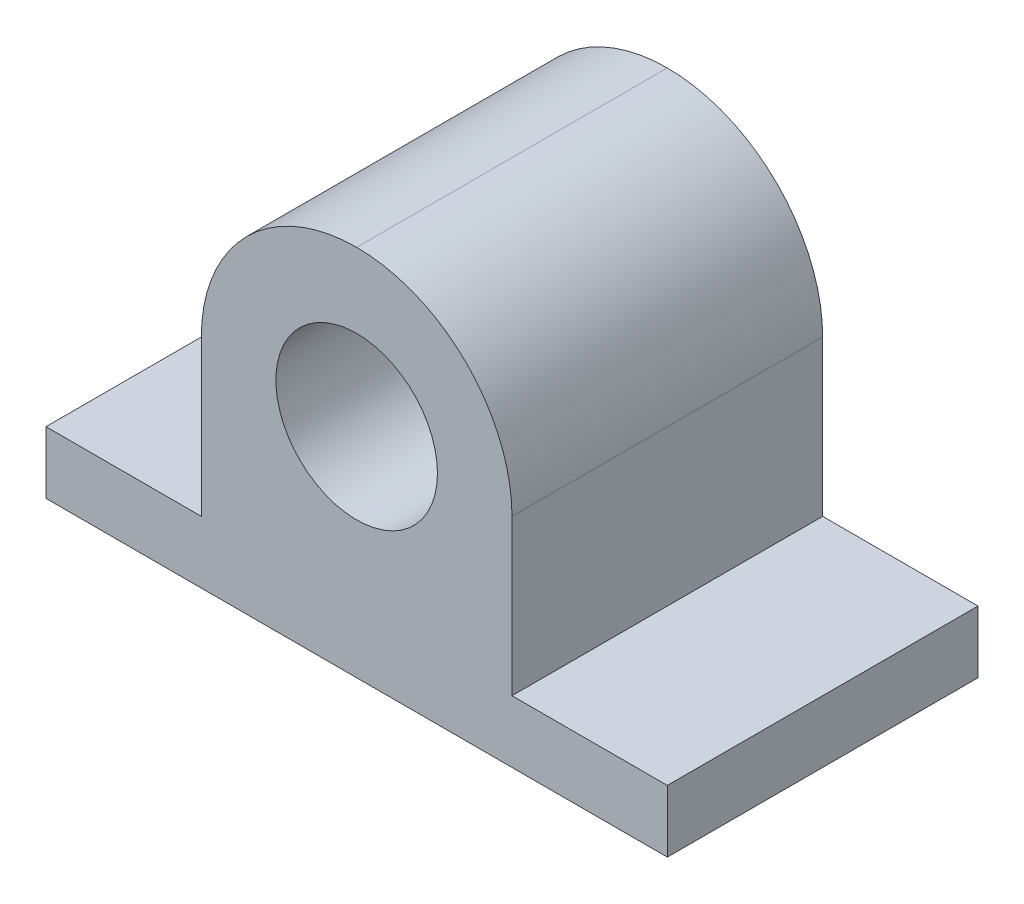
ISO-10303-21;
HEADER;
FILE_DESCRIPTION(('STEP AP214'),'2;1');
FILE_NAME('part.step','',(''),(''),'','','');
FILE_SCHEMA(('AUTOMOTIVE_DESIGN { 1 0 10303 214 1 1 1 1 }'));
ENDSEC;
DATA;
#1=APPLICATION_CONTEXT('core data for automotive mechanical design processes');
#2=APPLICATION_PROTOCOL_DEFINITION('international standard','automotive_design',2000,#1);
#3=PRODUCT_CONTEXT('',#1,'mechanical');
#4=PRODUCT('Part','Part','',(#3));
#5=PRODUCT_RELATED_PRODUCT_CATEGORY('part','',(#4));
#6=PRODUCT_DEFINITION_FORMATION('','',#4);
#7=PRODUCT_DEFINITION_CONTEXT('part definition',#1,'design');
#8=PRODUCT_DEFINITION('design','',#6,#7);
#9=PRODUCT_DEFINITION_SHAPE('','',#8);
#10=(LENGTH_UNIT() NAMED_UNIT(*) SI_UNIT(.MILLI.,.METRE.));
#11=(NAMED_UNIT(*) PLANE_ANGLE_UNIT() SI_UNIT($,.RADIAN.));
#12=(NAMED_UNIT(*) SI_UNIT($,.STERADIAN.) SOLID_ANGLE_UNIT());
#13=UNCERTAINTY_MEASURE_WITH_UNIT(LENGTH_MEASURE(1.E-05),#10,'distance_accuracy_value','');
#14=(GEOMETRIC_REPRESENTATION_CONTEXT(3) GLOBAL_UNCERTAINTY_ASSIGNED_CONTEXT((#13)) GLOBAL_UNIT_ASSIGNED_CONTEXT((#10,
#11,#12)) REPRESENTATION_CONTEXT('',''));
#15=CARTESIAN_POINT('',(0.,0.,0.));
#16=DIRECTION('',(0.,0.,1.));
#17=DIRECTION('',(1.,0.,0.));
#18=AXIS2_PLACEMENT_3D('',#15,#16,#17);
#19=CARTESIAN_POINT('',(0.,2.,0.));
#20=DIRECTION('',(0.,-1.,0.));
#21=DIRECTION('',(0.,0.,-1.));
#22=AXIS2_PLACEMENT_3D('',#19,#20,#21);
#23=PLANE('',#22);
#24=DIRECTION('',(0.,0.,1.));
#25=VECTOR('',#24,1.);
#26=CARTESIAN_POINT('',(5.,2.,-24.142135623731));
#27=LINE('',#26,#25);
#28=CARTESIAN_POINT('',(5.,2.,-10.));
#29=VERTEX_POINT('',#28);
#30=CARTESIAN_POINT('',(5.,2.,0.));
#31=VERTEX_POINT('',#30);
#32=EDGE_CURVE('E118',#29,#31,#27,.T.);
#33=ORIENTED_EDGE('',*,*,#32,.F.);
#34=DIRECTION('',(-1.,0.,0.));
#35=VECTOR('',#34,1.);
#36=CARTESIAN_POINT('',(0.,2.,-10.));
#37=LINE('',#36,#35);
#38=CARTESIAN_POINT('',(0.,2.,-10.));
#39=VERTEX_POINT('',#38);
#40=EDGE_CURVE('E141',#29,#39,#37,.T.);
#41=ORIENTED_EDGE('',*,*,#40,.T.);
#42=DIRECTION('',(0.,0.,1.));
#43=VECTOR('',#42,1.);
#44=CARTESIAN_POINT('',(0.,2.,0.));
#45=LINE('',#44,#43);
#46=CARTESIAN_POINT('',(0.,2.,0.));
#47=VERTEX_POINT('',#46);
#48=EDGE_CURVE('E121',#39,#47,#45,.T.);
#49=ORIENTED_EDGE('',*,*,#48,.T.);
#50=DIRECTION('',(1.,0.,0.));
#51=VECTOR('',#50,1.);
#52=CARTESIAN_POINT('',(0.,2.,0.));
#53=LINE('',#52,#51);
#54=EDGE_CURVE('E109',#47,#31,#53,.T.);
#55=ORIENTED_EDGE('',*,*,#54,.T.);
#56=EDGE_LOOP('',(#33,#41,#49,#55));
#57=FACE_BOUND('',#56,.T.);
#58=ADVANCED_FACE('F33',(#57),#23,.F.);
#59=CARTESIAN_POINT('',(0.,2.,0.));
#60=DIRECTION('',(1.,0.,0.));
#61=DIRECTION('',(0.,0.,-1.));
#62=AXIS2_PLACEMENT_3D('',#59,#60,#61);
#63=PLANE('',#62);
#64=DIRECTION('',(0.,0.,1.));
#65=VECTOR('',#64,1.);
#66=CARTESIAN_POINT('',(0.,0.,0.));
#67=LINE('',#66,#65);
#68=CARTESIAN_POINT('',(0.,0.,-10.));
#69=VERTEX_POINT('',#68);
#70=CARTESIAN_POINT('',(0.,0.,0.));
#71=VERTEX_POINT('',#70);
#72=EDGE_CURVE('E137',#69,#71,#67,.T.);
#73=ORIENTED_EDGE('',*,*,#72,.T.);
#74=DIRECTION('',(0.,-1.,0.));
#75=VECTOR('',#74,1.);
#76=CARTESIAN_POINT('',(0.,2.,0.));
#77=LINE('',#76,#75);
#78=EDGE_CURVE('E161',#47,#71,#77,.T.);
#79=ORIENTED_EDGE('',*,*,#78,.F.);
#80=ORIENTED_EDGE('',*,*,#48,.F.);
#81=DIRECTION('',(0.,-1.,0.));
#82=VECTOR('',#81,1.);
#83=CARTESIAN_POINT('',(0.,2.,-10.));
#84=LINE('',#83,#82);
#85=EDGE_CURVE('E145',#39,#69,#84,.T.);
#86=ORIENTED_EDGE('',*,*,#85,.T.);
#87=EDGE_LOOP('',(#73,#79,#80,#86));
#88=FACE_BOUND('',#87,.T.);
#89=ADVANCED_FACE('F195',(#88),#63,.F.);
#90=CARTESIAN_POINT('',(0.,2.,0.));
#91=DIRECTION('',(0.,0.,-1.));
#92=DIRECTION('',(-1.,0.,0.));
#93=AXIS2_PLACEMENT_3D('',#90,#91,#92);
#94=PLANE('',#93);
#95=DIRECTION('',(0.,1.,0.));
#96=VECTOR('',#95,1.);
#97=CARTESIAN_POINT('',(15.,2.,0.));
#98=LINE('',#97,#96);
#99=CARTESIAN_POINT('',(15.,2.,0.));
#100=VERTEX_POINT('',#99);
#101=CARTESIAN_POINT('',(15.,7.,0.));
#102=VERTEX_POINT('',#101);
#103=EDGE_CURVE('E114',#100,#102,#98,.T.);
#104=ORIENTED_EDGE('',*,*,#103,.T.);
#105=CARTESIAN_POINT('',(10.,7.,0.));
#106=DIRECTION('',(0.,0.,-1.));
#107=DIRECTION('',(-1.,0.,0.));
#108=AXIS2_PLACEMENT_3D('',#105,#106,#107);
#109=CIRCLE('',#108,5.);
#110=CARTESIAN_POINT('',(10.,12.,0.));
#111=VERTEX_POINT('',#110);
#112=EDGE_CURVE('E167',#102,#111,#109,.F.);
#113=ORIENTED_EDGE('',*,*,#112,.T.);
#114=CARTESIAN_POINT('',(10.,7.,0.));
#115=DIRECTION('',(0.,0.,-1.));
#116=DIRECTION('',(-1.,0.,0.));
#117=AXIS2_PLACEMENT_3D('',#114,#115,#116);
#118=CIRCLE('',#117,5.);
#119=CARTESIAN_POINT('',(5.,7.,0.));
#120=VERTEX_POINT('',#119);
#121=EDGE_CURVE('E112',#111,#120,#118,.F.);
#122=ORIENTED_EDGE('',*,*,#121,.T.);
#123=DIRECTION('',(0.,-1.,0.));
#124=VECTOR('',#123,1.);
#125=CARTESIAN_POINT('',(5.,2.,0.));
#126=LINE('',#125,#124);
#127=EDGE_CURVE('E103',#120,#31,#126,.T.);
#128=ORIENTED_EDGE('',*,*,#127,.T.);
#129=ORIENTED_EDGE('',*,*,#54,.F.);
#130=ORIENTED_EDGE('',*,*,#78,.T.);
#131=DIRECTION('',(1.,0.,0.));
#132=VECTOR('',#131,1.);
#133=CARTESIAN_POINT('',(0.,0.,0.));
#134=LINE('',#133,#132);
#135=CARTESIAN_POINT('',(20.,0.,0.));
#136=VERTEX_POINT('',#135);
#137=EDGE_CURVE('E148',#71,#136,#134,.T.);
#138=ORIENTED_EDGE('',*,*,#137,.T.);
#139=DIRECTION('',(0.,-1.,0.));
#140=VECTOR('',#139,1.);
#141=CARTESIAN_POINT('',(20.,2.,0.));
#142=LINE('',#141,#140);
#143=CARTESIAN_POINT('',(20.,2.,0.));
#144=VERTEX_POINT('',#143);
#145=EDGE_CURVE('E158',#144,#136,#142,.T.);
#146=ORIENTED_EDGE('',*,*,#145,.F.);
#147=EDGE_CURVE('E124',#100,#144,#53,.T.);
#148=ORIENTED_EDGE('',*,*,#147,.F.);
#149=EDGE_LOOP('',(#104,#113,#122,#128,#129,#130,#138,#146,#148));
#150=FACE_BOUND('',#149,.T.);
#151=CARTESIAN_POINT('',(10.,7.,0.));
#152=DIRECTION('',(0.,0.,1.));
#153=DIRECTION('',(1.,0.,0.));
#154=AXIS2_PLACEMENT_3D('',#151,#152,#153);
#155=CIRCLE('',#154,2.6);
#156=CARTESIAN_POINT('',(12.6,7.,0.));
#157=VERTEX_POINT('',#156);
#158=EDGE_CURVE('E115',#157,#157,#155,.T.);
#159=ORIENTED_EDGE('',*,*,#158,.F.);
#160=EDGE_LOOP('',(#159));
#161=FACE_BOUND('',#160,.T.);
#162=ADVANCED_FACE('F106',(#150,#161),#94,.F.);
#163=CARTESIAN_POINT('',(20.,2.,0.));
#164=DIRECTION('',(-1.,0.,0.));
#165=DIRECTION('',(0.,0.,1.));
#166=AXIS2_PLACEMENT_3D('',#163,#164,#165);
#167=PLANE('',#166);
#168=DIRECTION('',(0.,0.,-1.));
#169=VECTOR('',#168,1.);
#170=CARTESIAN_POINT('',(20.,0.,0.));
#171=LINE('',#170,#169);
#172=CARTESIAN_POINT('',(20.,0.,-10.));
#173=VERTEX_POINT('',#172);
#174=EDGE_CURVE('E150',#136,#173,#171,.T.);
#175=ORIENTED_EDGE('',*,*,#174,.T.);
#176=DIRECTION('',(0.,-1.,0.));
#177=VECTOR('',#176,1.);
#178=CARTESIAN_POINT('',(20.,2.,-10.));
#179=LINE('',#178,#177);
#180=CARTESIAN_POINT('',(20.,2.,-10.));
#181=VERTEX_POINT('',#180);
#182=EDGE_CURVE('E155',#181,#173,#179,.T.);
#183=ORIENTED_EDGE('',*,*,#182,.F.);
#184=DIRECTION('',(0.,0.,-1.));
#185=VECTOR('',#184,1.);
#186=CARTESIAN_POINT('',(20.,2.,0.));
#187=LINE('',#186,#185);
#188=EDGE_CURVE('E123',#144,#181,#187,.T.);
#189=ORIENTED_EDGE('',*,*,#188,.F.);
#190=ORIENTED_EDGE('',*,*,#145,.T.);
#191=EDGE_LOOP('',(#175,#183,#189,#190));
#192=FACE_BOUND('',#191,.T.);
#193=ADVANCED_FACE('F201',(#192),#167,.F.);
#194=CARTESIAN_POINT('',(0.,2.,-10.));
#195=DIRECTION('',(0.,0.,1.));
#196=DIRECTION('',(1.,0.,0.));
#197=AXIS2_PLACEMENT_3D('',#194,#195,#196);
#198=PLANE('',#197);
#199=CARTESIAN_POINT('',(10.,7.,-10.));
#200=DIRECTION('',(0.,0.,1.));
#201=DIRECTION('',(1.,0.,0.));
#202=AXIS2_PLACEMENT_3D('',#199,#200,#201);
#203=CIRCLE('',#202,5.);
#204=CARTESIAN_POINT('',(5.,7.,-10.));
#205=VERTEX_POINT('',#204);
#206=CARTESIAN_POINT('',(10.,12.,-10.));
#207=VERTEX_POINT('',#206);
#208=EDGE_CURVE('E49',#205,#207,#203,.F.);
#209=ORIENTED_EDGE('',*,*,#208,.T.);
#210=CARTESIAN_POINT('',(10.,7.,-10.));
#211=DIRECTION('',(0.,0.,1.));
#212=DIRECTION('',(1.,0.,0.));
#213=AXIS2_PLACEMENT_3D('',#210,#211,#212);
#214=CIRCLE('',#213,5.);
#215=CARTESIAN_POINT('',(15.,7.,-10.));
#216=VERTEX_POINT('',#215);
#217=EDGE_CURVE('E42',#207,#216,#214,.F.);
#218=ORIENTED_EDGE('',*,*,#217,.T.);
#219=DIRECTION('',(0.,-1.,0.));
#220=VECTOR('',#219,1.);
#221=CARTESIAN_POINT('',(15.,2.,-10.));
#222=LINE('',#221,#220);
#223=CARTESIAN_POINT('',(15.,2.,-10.));
#224=VERTEX_POINT('',#223);
#225=EDGE_CURVE('E130',#216,#224,#222,.T.);
#226=ORIENTED_EDGE('',*,*,#225,.T.);
#227=EDGE_CURVE('E142',#181,#224,#37,.T.);
#228=ORIENTED_EDGE('',*,*,#227,.F.);
#229=ORIENTED_EDGE('',*,*,#182,.T.);
#230=DIRECTION('',(-1.,0.,0.));
#231=VECTOR('',#230,1.);
#232=CARTESIAN_POINT('',(0.,0.,-10.));
#233=LINE('',#232,#231);
#234=EDGE_CURVE('E138',#173,#69,#233,.T.);
#235=ORIENTED_EDGE('',*,*,#234,.T.);
#236=ORIENTED_EDGE('',*,*,#85,.F.);
#237=ORIENTED_EDGE('',*,*,#40,.F.);
#238=DIRECTION('',(0.,1.,0.));
#239=VECTOR('',#238,1.);
#240=CARTESIAN_POINT('',(5.,2.,-10.));
#241=LINE('',#240,#239);
#242=EDGE_CURVE('E127',#29,#205,#241,.T.);
#243=ORIENTED_EDGE('',*,*,#242,.T.);
#244=EDGE_LOOP('',(#209,#218,#226,#228,#229,#235,#236,#237,#243));
#245=FACE_BOUND('',#244,.T.);
#246=CARTESIAN_POINT('',(10.,7.,-10.));
#247=DIRECTION('',(0.,0.,1.));
#248=DIRECTION('',(1.,0.,0.));
#249=AXIS2_PLACEMENT_3D('',#246,#247,#248);
#250=CIRCLE('',#249,2.6);
#251=CARTESIAN_POINT('',(12.6,7.,-10.));
#252=VERTEX_POINT('',#251);
#253=EDGE_CURVE('E134',#252,#252,#250,.F.);
#254=ORIENTED_EDGE('',*,*,#253,.F.);
#255=EDGE_LOOP('',(#254));
#256=FACE_BOUND('',#255,.T.);
#257=ADVANCED_FACE('F172',(#245,#256),#198,.F.);
#258=ORIENTED_EDGE('',*,*,#227,.T.);
#259=DIRECTION('',(0.,0.,1.));
#260=VECTOR('',#259,1.);
#261=CARTESIAN_POINT('',(15.,2.,-24.142135623731));
#262=LINE('',#261,#260);
#263=EDGE_CURVE('E128',#224,#100,#262,.T.);
#264=ORIENTED_EDGE('',*,*,#263,.T.);
#265=ORIENTED_EDGE('',*,*,#147,.T.);
#266=ORIENTED_EDGE('',*,*,#188,.T.);
#267=EDGE_LOOP('',(#258,#264,#265,#266));
#268=FACE_BOUND('',#267,.T.);
#269=ADVANCED_FACE('F205',(#268),#23,.F.);
#270=CARTESIAN_POINT('',(0.,0.,0.));
#271=DIRECTION('',(0.,-1.,0.));
#272=DIRECTION('',(0.,0.,-1.));
#273=AXIS2_PLACEMENT_3D('',#270,#271,#272);
#274=PLANE('',#273);
#275=ORIENTED_EDGE('',*,*,#72,.F.);
#276=ORIENTED_EDGE('',*,*,#234,.F.);
#277=ORIENTED_EDGE('',*,*,#174,.F.);
#278=ORIENTED_EDGE('',*,*,#137,.F.);
#279=EDGE_LOOP('',(#275,#276,#277,#278));
#280=FACE_BOUND('',#279,.T.);
#281=ADVANCED_FACE('F203',(#280),#274,.T.);
#282=CARTESIAN_POINT('',(15.,2.,-24.142135623731));
#283=DIRECTION('',(1.,0.,0.));
#284=DIRECTION('',(0.,1.,0.));
#285=AXIS2_PLACEMENT_3D('',#282,#283,#284);
#286=PLANE('',#285);
#287=ORIENTED_EDGE('',*,*,#225,.F.);
#288=DIRECTION('',(0.,0.,1.));
#289=VECTOR('',#288,1.);
#290=CARTESIAN_POINT('',(15.,7.,-24.142135623731));
#291=LINE('',#290,#289);
#292=EDGE_CURVE('E163',#216,#102,#291,.T.);
#293=ORIENTED_EDGE('',*,*,#292,.T.);
#294=ORIENTED_EDGE('',*,*,#103,.F.);
#295=ORIENTED_EDGE('',*,*,#263,.F.);
#296=EDGE_LOOP('',(#287,#293,#294,#295));
#297=FACE_BOUND('',#296,.T.);
#298=ADVANCED_FACE('F180',(#297),#286,.T.);
#299=CARTESIAN_POINT('',(5.,2.,-24.142135623731));
#300=DIRECTION('',(-1.,0.,0.));
#301=DIRECTION('',(0.,-1.,0.));
#302=AXIS2_PLACEMENT_3D('',#299,#300,#301);
#303=PLANE('',#302);
#304=ORIENTED_EDGE('',*,*,#127,.F.);
#305=DIRECTION('',(0.,0.,1.));
#306=VECTOR('',#305,1.);
#307=CARTESIAN_POINT('',(5.,7.,-24.142135623731));
#308=LINE('',#307,#306);
#309=EDGE_CURVE('E11',#120,#205,#308,.F.);
#310=ORIENTED_EDGE('',*,*,#309,.T.);
#311=ORIENTED_EDGE('',*,*,#242,.F.);
#312=ORIENTED_EDGE('',*,*,#32,.T.);
#313=EDGE_LOOP('',(#304,#310,#311,#312));
#314=FACE_BOUND('',#313,.T.);
#315=ADVANCED_FACE('F126',(#314),#303,.T.);
#316=CARTESIAN_POINT('',(10.,7.,-24.142135623731));
#317=DIRECTION('',(0.,0.,1.));
#318=DIRECTION('',(1.,0.,0.));
#319=AXIS2_PLACEMENT_3D('',#316,#317,#318);
#320=CYLINDRICAL_SURFACE('',#319,2.6);
#321=CARTESIAN_POINT('',(12.6,7.,-10.));
#322=CARTESIAN_POINT('',(12.6,7.,-9.89583333333333));
#323=CARTESIAN_POINT('',(12.6,7.,-9.79166666666667));
#324=CARTESIAN_POINT('',(12.6,7.,-9.58333333333333));
#325=CARTESIAN_POINT('',(12.6,7.,-9.47916666666667));
#326=CARTESIAN_POINT('',(12.6,7.,-9.27083333333333));
#327=CARTESIAN_POINT('',(12.6,7.,-9.16666666666667));
#328=CARTESIAN_POINT('',(12.6,7.,-8.95833333333333));
#329=CARTESIAN_POINT('',(12.6,7.,-8.85416666666667));
#330=CARTESIAN_POINT('',(12.6,7.,-8.64583333333334));
#331=CARTESIAN_POINT('',(12.6,7.,-8.54166666666667));
#332=CARTESIAN_POINT('',(12.6,7.,-8.33333333333334));
#333=CARTESIAN_POINT('',(12.6,7.,-8.22916666666667));
#334=CARTESIAN_POINT('',(12.6,7.,-8.02083333333334));
#335=CARTESIAN_POINT('',(12.6,7.,-7.91666666666667));
#336=CARTESIAN_POINT('',(12.6,7.,-7.70833333333334));
#337=CARTESIAN_POINT('',(12.6,7.,-7.60416666666667));
#338=CARTESIAN_POINT('',(12.6,7.,-7.39583333333334));
#339=CARTESIAN_POINT('',(12.6,7.,-7.29166666666667));
#340=CARTESIAN_POINT('',(12.6,7.,-7.08333333333334));
#341=CARTESIAN_POINT('',(12.6,7.,-6.97916666666667));
#342=CARTESIAN_POINT('',(12.6,7.,-6.77083333333334));
#343=CARTESIAN_POINT('',(12.6,7.,-6.66666666666667));
#344=CARTESIAN_POINT('',(12.6,7.,-6.45833333333334));
#345=CARTESIAN_POINT('',(12.6,7.,-6.35416666666667));
#346=CARTESIAN_POINT('',(12.6,7.,-6.14583333333334));
#347=CARTESIAN_POINT('',(12.6,7.,-6.04166666666667));
#348=CARTESIAN_POINT('',(12.6,7.,-5.83333333333334));
#349=CARTESIAN_POINT('',(12.6,7.,-5.72916666666667));
#350=CARTESIAN_POINT('',(12.6,7.,-5.52083333333333));
#351=CARTESIAN_POINT('',(12.6,7.,-5.41666666666667));
#352=CARTESIAN_POINT('',(12.6,7.,-5.20833333333333));
#353=CARTESIAN_POINT('',(12.6,7.,-5.10416666666667));
#354=CARTESIAN_POINT('',(12.6,7.,-4.89583333333333));
#355=CARTESIAN_POINT('',(12.6,7.,-4.79166666666667));
#356=CARTESIAN_POINT('',(12.6,7.,-4.58333333333333));
#357=CARTESIAN_POINT('',(12.6,7.,-4.47916666666667));
#358=CARTESIAN_POINT('',(12.6,7.,-4.27083333333334));
#359=CARTESIAN_POINT('',(12.6,7.,-4.16666666666667));
#360=CARTESIAN_POINT('',(12.6,7.,-3.95833333333334));
#361=CARTESIAN_POINT('',(12.6,7.,-3.85416666666667));
#362=CARTESIAN_POINT('',(12.6,7.,-3.64583333333334));
#363=CARTESIAN_POINT('',(12.6,7.,-3.54166666666667));
#364=CARTESIAN_POINT('',(12.6,7.,-3.33333333333334));
#365=CARTESIAN_POINT('',(12.6,7.,-3.22916666666667));
#366=CARTESIAN_POINT('',(12.6,7.,-3.02083333333334));
#367=CARTESIAN_POINT('',(12.6,7.,-2.91666666666667));
#368=CARTESIAN_POINT('',(12.6,7.,-2.70833333333334));
#369=CARTESIAN_POINT('',(12.6,7.,-2.60416666666667));
#370=CARTESIAN_POINT('',(12.6,7.,-2.39583333333334));
#371=CARTESIAN_POINT('',(12.6,7.,-2.29166666666667));
#372=CARTESIAN_POINT('',(12.6,7.,-2.08333333333334));
#373=CARTESIAN_POINT('',(12.6,7.,-1.97916666666667));
#374=CARTESIAN_POINT('',(12.6,7.,-1.77083333333334));
#375=CARTESIAN_POINT('',(12.6,7.,-1.66666666666667));
#376=CARTESIAN_POINT('',(12.6,7.,-1.45833333333334));
#377=CARTESIAN_POINT('',(12.6,7.,-1.35416666666667));
#378=CARTESIAN_POINT('',(12.6,7.,-1.14583333333334));
#379=CARTESIAN_POINT('',(12.6,7.,-1.04166666666667));
#380=CARTESIAN_POINT('',(12.6,7.,-0.833333333333338));
#381=CARTESIAN_POINT('',(12.6,7.,-0.729166666666671));
#382=CARTESIAN_POINT('',(12.6,7.,-0.520833333333337));
#383=CARTESIAN_POINT('',(12.6,7.,-0.41666666666667));
#384=CARTESIAN_POINT('',(12.6,7.,-0.208333333333337));
#385=CARTESIAN_POINT('',(12.6,7.,-0.10416666666667));
#386=CARTESIAN_POINT('',(12.6,7.,0.));
#387=B_SPLINE_CURVE_WITH_KNOTS('',3,(#321,#322,#323,#324,#325,#326,#327,#328,#329,#330,#331,
#332,#333,#334,#335,#336,#337,#338,#339,#340,#341,#342,#343,#344,#345,#346,#347,#348,#349,#350,
#351,#352,#353,#354,#355,#356,#357,#358,#359,#360,#361,#362,#363,#364,#365,#366,#367,#368,#369,
#370,#371,#372,#373,#374,#375,#376,#377,#378,#379,#380,#381,#382,#383,#384,#385,#386),
.UNSPECIFIED.,.F.,.F.,(4,2,2,2,2,2,2,2,2,2,2,2,2,2,2,2,2,2,2,2,2,2,2,2,2,2,2,2,2,2,2,2,4),(0.,
0.3125,0.625000000000001,0.937499999999999,1.25,1.5625,1.875,2.1875,2.5,2.8125,3.125,3.4375,
3.75,4.0625,4.375,4.6875,5.,5.3125,5.625,5.9375,6.25,6.5625,6.875,7.1875,7.5,7.8125,
8.12499999999999,8.43749999999999,8.75,9.0625,9.375,9.6875,10.),.UNSPECIFIED.);
#388=EDGE_CURVE('BSEAM222',#252,#157,#387,.T.);
#389=ORIENTED_EDGE('',*,*,#253,.T.);
#390=ORIENTED_EDGE('',*,*,#158,.T.);
#391=ORIENTED_EDGE('',*,*,#388,.T.);
#392=ORIENTED_EDGE('',*,*,#388,.F.);
#393=EDGE_LOOP('',(#389,#391,#390,#392));
#394=FACE_BOUND('',#393,.T.);
#395=ADVANCED_FACE('F222',(#394),#320,.F.);
#396=CARTESIAN_POINT('',(10.,7.,-24.142135623731));
#397=DIRECTION('',(0.,0.,1.));
#398=DIRECTION('',(1.,0.,0.));
#399=AXIS2_PLACEMENT_3D('',#396,#397,#398);
#400=CYLINDRICAL_SURFACE('',#399,5.);
#401=DIRECTION('',(0.,0.,1.));
#402=VECTOR('',#401,1.);
#403=CARTESIAN_POINT('',(10.,12.,-24.142135623731));
#404=LINE('',#403,#402);
#405=EDGE_CURVE('E37',#207,#111,#404,.T.);
#406=ORIENTED_EDGE('',*,*,#405,.F.);
#407=ORIENTED_EDGE('',*,*,#208,.F.);
#408=ORIENTED_EDGE('',*,*,#309,.F.);
#409=ORIENTED_EDGE('',*,*,#121,.F.);
#410=EDGE_LOOP('',(#406,#407,#408,#409));
#411=FACE_BOUND('',#410,.T.);
#412=ADVANCED_FACE('F35',(#411),#400,.T.);
#413=CARTESIAN_POINT('',(10.,7.,-24.142135623731));
#414=DIRECTION('',(0.,0.,1.));
#415=DIRECTION('',(1.,0.,0.));
#416=AXIS2_PLACEMENT_3D('',#413,#414,#415);
#417=CYLINDRICAL_SURFACE('',#416,5.);
#418=ORIENTED_EDGE('',*,*,#217,.F.);
#419=ORIENTED_EDGE('',*,*,#405,.T.);
#420=ORIENTED_EDGE('',*,*,#112,.F.);
#421=ORIENTED_EDGE('',*,*,#292,.F.);
#422=EDGE_LOOP('',(#418,#419,#420,#421));
#423=FACE_BOUND('',#422,.T.);
#424=ADVANCED_FACE('F183',(#423),#417,.T.);
#425=CLOSED_SHELL('',(#58,#89,#162,#193,#257,#269,#281,#298,#315,#395,#412,#424));
#426=MANIFOLD_SOLID_BREP('B2',#425);
#427=ADVANCED_BREP_SHAPE_REPRESENTATION('',(#18,#426),#14);
#428=SHAPE_DEFINITION_REPRESENTATION(#9,#427);
ENDSEC;
END-ISO-10303-21;
